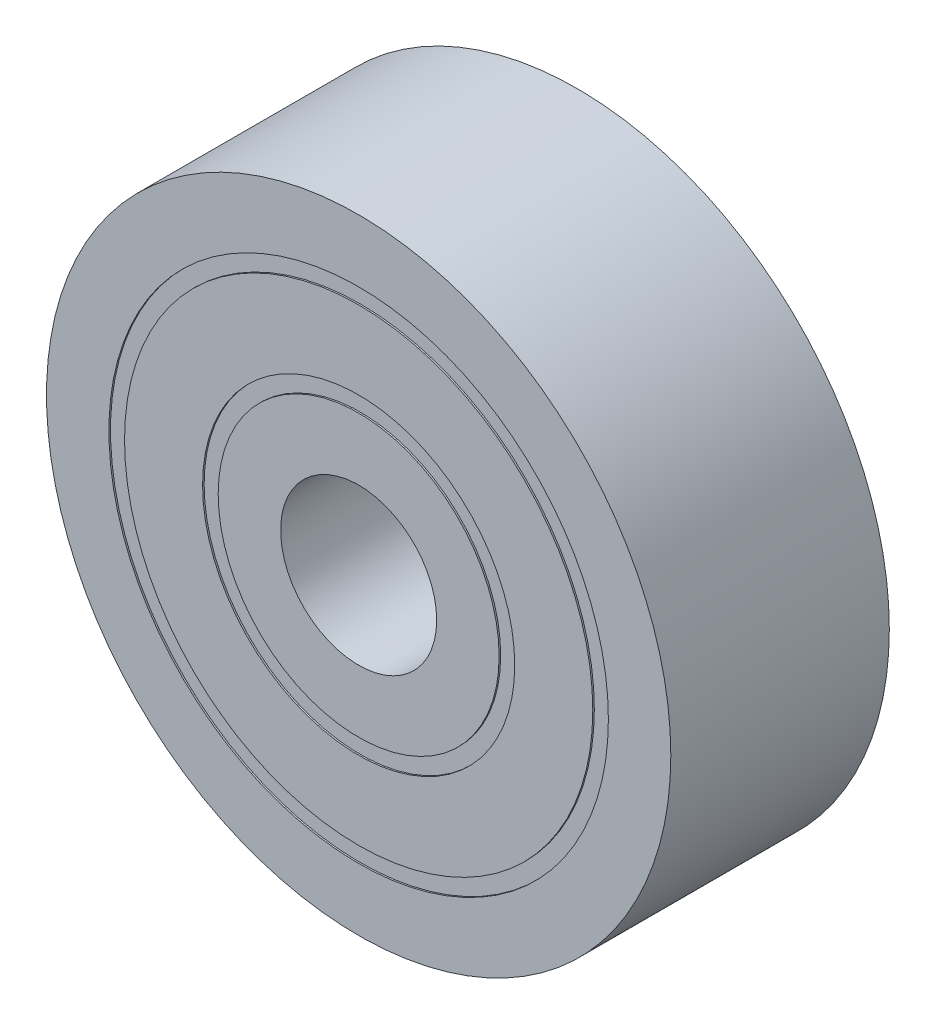
ISO-10303-21;
HEADER;
FILE_DESCRIPTION(('STEP AP214'),'2;1');
FILE_NAME('part.step','',(''),(''),'','','');
FILE_SCHEMA(('AUTOMOTIVE_DESIGN { 1 0 10303 214 1 1 1 1 }'));
ENDSEC;
DATA;
#1=APPLICATION_CONTEXT('core data for automotive mechanical design processes');
#2=APPLICATION_PROTOCOL_DEFINITION('international standard','automotive_design',2000,#1);
#3=PRODUCT_CONTEXT('',#1,'mechanical');
#4=PRODUCT('Part','Part','',(#3));
#5=PRODUCT_RELATED_PRODUCT_CATEGORY('part','',(#4));
#6=PRODUCT_DEFINITION_FORMATION('','',#4);
#7=PRODUCT_DEFINITION_CONTEXT('part definition',#1,'design');
#8=PRODUCT_DEFINITION('design','',#6,#7);
#9=PRODUCT_DEFINITION_SHAPE('','',#8);
#10=(LENGTH_UNIT() NAMED_UNIT(*) SI_UNIT(.MILLI.,.METRE.));
#11=(NAMED_UNIT(*) PLANE_ANGLE_UNIT() SI_UNIT($,.RADIAN.));
#12=(NAMED_UNIT(*) SI_UNIT($,.STERADIAN.) SOLID_ANGLE_UNIT());
#13=UNCERTAINTY_MEASURE_WITH_UNIT(LENGTH_MEASURE(1.E-05),#10,'distance_accuracy_value','');
#14=(GEOMETRIC_REPRESENTATION_CONTEXT(3) GLOBAL_UNCERTAINTY_ASSIGNED_CONTEXT((#13)) GLOBAL_UNIT_ASSIGNED_CONTEXT((#10,
#11,#12)) REPRESENTATION_CONTEXT('',''));
#15=CARTESIAN_POINT('',(0.,0.,0.));
#16=DIRECTION('',(0.,0.,1.));
#17=DIRECTION('',(1.,0.,0.));
#18=AXIS2_PLACEMENT_3D('',#15,#16,#17);
#19=CARTESIAN_POINT('',(0.,0.,-17.5));
#20=DIRECTION('',(0.,0.,1.));
#21=DIRECTION('',(1.,0.,0.));
#22=AXIS2_PLACEMENT_3D('',#19,#20,#21);
#23=PLANE('',#22);
#24=CARTESIAN_POINT('',(0.,0.,-17.5));
#25=DIRECTION('',(0.,0.,1.));
#26=DIRECTION('',(1.,0.,0.));
#27=AXIS2_PLACEMENT_3D('',#24,#25,#26);
#28=CIRCLE('',#27,12.5);
#29=CARTESIAN_POINT('',(12.5,0.,-17.5));
#30=VERTEX_POINT('',#29);
#31=EDGE_CURVE('E78',#30,#30,#28,.T.);
#32=ORIENTED_EDGE('',*,*,#31,.T.);
#33=EDGE_LOOP('',(#32));
#34=FACE_BOUND('',#33,.T.);
#35=CARTESIAN_POINT('',(0.,0.,-17.5));
#36=DIRECTION('',(0.,0.,1.));
#37=DIRECTION('',(1.,0.,0.));
#38=AXIS2_PLACEMENT_3D('',#35,#36,#37);
#39=CIRCLE('',#38,22.5);
#40=CARTESIAN_POINT('',(22.5,0.,-17.5));
#41=VERTEX_POINT('',#40);
#42=EDGE_CURVE('E123',#41,#41,#39,.T.);
#43=ORIENTED_EDGE('',*,*,#42,.F.);
#44=EDGE_LOOP('',(#43));
#45=FACE_BOUND('',#44,.T.);
#46=ADVANCED_FACE('F63',(#34,#45),#23,.F.);
#47=CARTESIAN_POINT('',(0.,0.,17.5));
#48=DIRECTION('',(0.,0.,1.));
#49=DIRECTION('',(1.,0.,0.));
#50=AXIS2_PLACEMENT_3D('',#47,#48,#49);
#51=PLANE('',#50);
#52=CARTESIAN_POINT('',(0.,0.,17.5));
#53=DIRECTION('',(0.,0.,1.));
#54=DIRECTION('',(1.,0.,0.));
#55=AXIS2_PLACEMENT_3D('',#52,#53,#54);
#56=CIRCLE('',#55,12.5);
#57=CARTESIAN_POINT('',(12.5,0.,17.5));
#58=VERTEX_POINT('',#57);
#59=EDGE_CURVE('E76',#58,#58,#56,.T.);
#60=ORIENTED_EDGE('',*,*,#59,.F.);
#61=EDGE_LOOP('',(#60));
#62=FACE_BOUND('',#61,.T.);
#63=CARTESIAN_POINT('',(0.,0.,17.5));
#64=DIRECTION('',(0.,0.,1.));
#65=DIRECTION('',(1.,0.,0.));
#66=AXIS2_PLACEMENT_3D('',#63,#64,#65);
#67=CIRCLE('',#66,22.5);
#68=CARTESIAN_POINT('',(22.5,0.,17.5));
#69=VERTEX_POINT('',#68);
#70=EDGE_CURVE('E91',#69,#69,#67,.T.);
#71=ORIENTED_EDGE('',*,*,#70,.T.);
#72=EDGE_LOOP('',(#71));
#73=FACE_BOUND('',#72,.T.);
#74=ADVANCED_FACE('F171',(#62,#73),#51,.T.);
#75=CARTESIAN_POINT('',(0.,0.,17.5));
#76=DIRECTION('',(0.,0.,1.));
#77=DIRECTION('',(1.,0.,0.));
#78=AXIS2_PLACEMENT_3D('',#75,#76,#77);
#79=CIRCLE('',#78,40.);
#80=CARTESIAN_POINT('',(40.,0.,17.5));
#81=VERTEX_POINT('',#80);
#82=EDGE_CURVE('E102',#81,#81,#79,.T.);
#83=ORIENTED_EDGE('',*,*,#82,.F.);
#84=EDGE_LOOP('',(#83));
#85=FACE_BOUND('',#84,.T.);
#86=CARTESIAN_POINT('',(0.,0.,17.5));
#87=DIRECTION('',(0.,0.,1.));
#88=DIRECTION('',(1.,0.,0.));
#89=AXIS2_PLACEMENT_3D('',#86,#87,#88);
#90=CIRCLE('',#89,50.);
#91=CARTESIAN_POINT('',(50.,0.,17.5));
#92=VERTEX_POINT('',#91);
#93=EDGE_CURVE('E13',#92,#92,#90,.T.);
#94=ORIENTED_EDGE('',*,*,#93,.T.);
#95=EDGE_LOOP('',(#94));
#96=FACE_BOUND('',#95,.T.);
#97=ADVANCED_FACE('F174',(#85,#96),#51,.T.);
#98=CARTESIAN_POINT('',(0.,0.,-17.5));
#99=DIRECTION('',(0.,0.,1.));
#100=DIRECTION('',(1.,0.,0.));
#101=AXIS2_PLACEMENT_3D('',#98,#99,#100);
#102=CIRCLE('',#101,40.);
#103=CARTESIAN_POINT('',(40.,0.,-17.5));
#104=VERTEX_POINT('',#103);
#105=EDGE_CURVE('E134',#104,#104,#102,.T.);
#106=ORIENTED_EDGE('',*,*,#105,.T.);
#107=EDGE_LOOP('',(#106));
#108=FACE_BOUND('',#107,.T.);
#109=CARTESIAN_POINT('',(0.,0.,-17.5));
#110=DIRECTION('',(0.,0.,1.));
#111=DIRECTION('',(1.,0.,0.));
#112=AXIS2_PLACEMENT_3D('',#109,#110,#111);
#113=CIRCLE('',#112,50.);
#114=CARTESIAN_POINT('',(50.,0.,-17.5));
#115=VERTEX_POINT('',#114);
#116=EDGE_CURVE('E67',#115,#115,#113,.T.);
#117=ORIENTED_EDGE('',*,*,#116,.F.);
#118=EDGE_LOOP('',(#117));
#119=FACE_BOUND('',#118,.T.);
#120=ADVANCED_FACE('F164',(#108,#119),#23,.F.);
#121=CARTESIAN_POINT('',(0.,0.,17.5));
#122=DIRECTION('',(0.,0.,-1.));
#123=DIRECTION('',(-1.,0.,0.));
#124=AXIS2_PLACEMENT_3D('',#121,#122,#123);
#125=CYLINDRICAL_SURFACE('',#124,50.);
#126=ORIENTED_EDGE('',*,*,#93,.F.);
#127=EDGE_LOOP('',(#126));
#128=FACE_BOUND('',#127,.T.);
#129=ORIENTED_EDGE('',*,*,#116,.T.);
#130=EDGE_LOOP('',(#129));
#131=FACE_BOUND('',#130,.T.);
#132=ADVANCED_FACE('F65',(#128,#131),#125,.T.);
#133=CARTESIAN_POINT('',(0.,0.,17.5));
#134=DIRECTION('',(0.,0.,-1.));
#135=DIRECTION('',(-1.,0.,0.));
#136=AXIS2_PLACEMENT_3D('',#133,#134,#135);
#137=CYLINDRICAL_SURFACE('',#136,12.5);
#138=ORIENTED_EDGE('',*,*,#59,.T.);
#139=EDGE_LOOP('',(#138));
#140=FACE_BOUND('',#139,.T.);
#141=ORIENTED_EDGE('',*,*,#31,.F.);
#142=EDGE_LOOP('',(#141));
#143=FACE_BOUND('',#142,.T.);
#144=ADVANCED_FACE('F180',(#140,#143),#137,.F.);
#145=CARTESIAN_POINT('',(0.,0.,17.25));
#146=DIRECTION('',(0.,0.,1.));
#147=DIRECTION('',(1.,0.,0.));
#148=AXIS2_PLACEMENT_3D('',#145,#146,#147);
#149=CYLINDRICAL_SURFACE('',#148,22.5);
#150=CARTESIAN_POINT('',(0.,0.,17.25));
#151=DIRECTION('',(0.,0.,1.));
#152=DIRECTION('',(1.,0.,0.));
#153=AXIS2_PLACEMENT_3D('',#150,#151,#152);
#154=CIRCLE('',#153,22.5);
#155=CARTESIAN_POINT('',(22.5,0.,17.25));
#156=VERTEX_POINT('',#155);
#157=EDGE_CURVE('E90',#156,#156,#154,.T.);
#158=ORIENTED_EDGE('',*,*,#157,.T.);
#159=EDGE_LOOP('',(#158));
#160=FACE_BOUND('',#159,.T.);
#161=ORIENTED_EDGE('',*,*,#70,.F.);
#162=EDGE_LOOP('',(#161));
#163=FACE_BOUND('',#162,.T.);
#164=ADVANCED_FACE('F225',(#160,#163),#149,.T.);
#165=CARTESIAN_POINT('',(0.,0.,17.25));
#166=DIRECTION('',(0.,0.,1.));
#167=DIRECTION('',(1.,0.,0.));
#168=AXIS2_PLACEMENT_3D('',#165,#166,#167);
#169=CYLINDRICAL_SURFACE('',#168,25.);
#170=CARTESIAN_POINT('',(0.,0.,17.25));
#171=DIRECTION('',(0.,0.,1.));
#172=DIRECTION('',(1.,0.,0.));
#173=AXIS2_PLACEMENT_3D('',#170,#171,#172);
#174=CIRCLE('',#173,25.);
#175=CARTESIAN_POINT('',(25.,0.,17.25));
#176=VERTEX_POINT('',#175);
#177=EDGE_CURVE('E82',#176,#176,#174,.T.);
#178=ORIENTED_EDGE('',*,*,#177,.F.);
#179=EDGE_LOOP('',(#178));
#180=FACE_BOUND('',#179,.T.);
#181=CARTESIAN_POINT('',(0.,0.,17.5));
#182=DIRECTION('',(0.,0.,1.));
#183=DIRECTION('',(1.,0.,0.));
#184=AXIS2_PLACEMENT_3D('',#181,#182,#183);
#185=CIRCLE('',#184,25.);
#186=CARTESIAN_POINT('',(25.,0.,17.5));
#187=VERTEX_POINT('',#186);
#188=EDGE_CURVE('E86',#187,#187,#185,.T.);
#189=ORIENTED_EDGE('',*,*,#188,.T.);
#190=EDGE_LOOP('',(#189));
#191=FACE_BOUND('',#190,.T.);
#192=ADVANCED_FACE('F221',(#180,#191),#169,.F.);
#193=CARTESIAN_POINT('',(0.,0.,17.25));
#194=DIRECTION('',(0.,0.,1.));
#195=DIRECTION('',(1.,0.,0.));
#196=AXIS2_PLACEMENT_3D('',#193,#194,#195);
#197=PLANE('',#196);
#198=ORIENTED_EDGE('',*,*,#157,.F.);
#199=EDGE_LOOP('',(#198));
#200=FACE_BOUND('',#199,.T.);
#201=ORIENTED_EDGE('',*,*,#177,.T.);
#202=EDGE_LOOP('',(#201));
#203=FACE_BOUND('',#202,.T.);
#204=ADVANCED_FACE('F217',(#200,#203),#197,.T.);
#205=CARTESIAN_POINT('',(0.,0.,17.25));
#206=DIRECTION('',(0.,0.,1.));
#207=DIRECTION('',(1.,0.,0.));
#208=AXIS2_PLACEMENT_3D('',#205,#206,#207);
#209=CYLINDRICAL_SURFACE('',#208,37.5);
#210=CARTESIAN_POINT('',(0.,0.,17.25));
#211=DIRECTION('',(0.,0.,1.));
#212=DIRECTION('',(1.,0.,0.));
#213=AXIS2_PLACEMENT_3D('',#210,#211,#212);
#214=CIRCLE('',#213,37.5);
#215=CARTESIAN_POINT('',(37.5,0.,17.25));
#216=VERTEX_POINT('',#215);
#217=EDGE_CURVE('E106',#216,#216,#214,.T.);
#218=ORIENTED_EDGE('',*,*,#217,.T.);
#219=EDGE_LOOP('',(#218));
#220=FACE_BOUND('',#219,.T.);
#221=CARTESIAN_POINT('',(0.,0.,17.5));
#222=DIRECTION('',(0.,0.,1.));
#223=DIRECTION('',(1.,0.,0.));
#224=AXIS2_PLACEMENT_3D('',#221,#222,#223);
#225=CIRCLE('',#224,37.5);
#226=CARTESIAN_POINT('',(37.5,0.,17.5));
#227=VERTEX_POINT('',#226);
#228=EDGE_CURVE('E107',#227,#227,#225,.T.);
#229=ORIENTED_EDGE('',*,*,#228,.F.);
#230=EDGE_LOOP('',(#229));
#231=FACE_BOUND('',#230,.T.);
#232=ADVANCED_FACE('F213',(#220,#231),#209,.T.);
#233=CARTESIAN_POINT('',(0.,0.,17.25));
#234=DIRECTION('',(0.,0.,1.));
#235=DIRECTION('',(1.,0.,0.));
#236=AXIS2_PLACEMENT_3D('',#233,#234,#235);
#237=CYLINDRICAL_SURFACE('',#236,40.);
#238=CARTESIAN_POINT('',(0.,0.,17.25));
#239=DIRECTION('',(0.,0.,1.));
#240=DIRECTION('',(1.,0.,0.));
#241=AXIS2_PLACEMENT_3D('',#238,#239,#240);
#242=CIRCLE('',#241,40.);
#243=CARTESIAN_POINT('',(40.,0.,17.25));
#244=VERTEX_POINT('',#243);
#245=EDGE_CURVE('E95',#244,#244,#242,.T.);
#246=ORIENTED_EDGE('',*,*,#245,.F.);
#247=EDGE_LOOP('',(#246));
#248=FACE_BOUND('',#247,.T.);
#249=ORIENTED_EDGE('',*,*,#82,.T.);
#250=EDGE_LOOP('',(#249));
#251=FACE_BOUND('',#250,.T.);
#252=ADVANCED_FACE('F209',(#248,#251),#237,.F.);
#253=CARTESIAN_POINT('',(0.,0.,17.25));
#254=DIRECTION('',(0.,0.,1.));
#255=DIRECTION('',(1.,0.,0.));
#256=AXIS2_PLACEMENT_3D('',#253,#254,#255);
#257=PLANE('',#256);
#258=ORIENTED_EDGE('',*,*,#217,.F.);
#259=EDGE_LOOP('',(#258));
#260=FACE_BOUND('',#259,.T.);
#261=ORIENTED_EDGE('',*,*,#245,.T.);
#262=EDGE_LOOP('',(#261));
#263=FACE_BOUND('',#262,.T.);
#264=ADVANCED_FACE('F206',(#260,#263),#257,.T.);
#265=ORIENTED_EDGE('',*,*,#188,.F.);
#266=EDGE_LOOP('',(#265));
#267=FACE_BOUND('',#266,.T.);
#268=ORIENTED_EDGE('',*,*,#228,.T.);
#269=EDGE_LOOP('',(#268));
#270=FACE_BOUND('',#269,.T.);
#271=ADVANCED_FACE('F183',(#267,#270),#51,.T.);
#272=CARTESIAN_POINT('',(0.,0.,-17.25));
#273=DIRECTION('',(0.,0.,-1.));
#274=DIRECTION('',(-1.,0.,0.));
#275=AXIS2_PLACEMENT_3D('',#272,#273,#274);
#276=CYLINDRICAL_SURFACE('',#275,22.5);
#277=CARTESIAN_POINT('',(0.,0.,-17.25));
#278=DIRECTION('',(0.,0.,1.));
#279=DIRECTION('',(1.,0.,0.));
#280=AXIS2_PLACEMENT_3D('',#277,#278,#279);
#281=CIRCLE('',#280,22.5);
#282=CARTESIAN_POINT('',(22.5,0.,-17.25));
#283=VERTEX_POINT('',#282);
#284=EDGE_CURVE('E122',#283,#283,#281,.T.);
#285=ORIENTED_EDGE('',*,*,#284,.F.);
#286=EDGE_LOOP('',(#285));
#287=FACE_BOUND('',#286,.T.);
#288=ORIENTED_EDGE('',*,*,#42,.T.);
#289=EDGE_LOOP('',(#288));
#290=FACE_BOUND('',#289,.T.);
#291=ADVANCED_FACE('F201',(#287,#290),#276,.T.);
#292=CARTESIAN_POINT('',(0.,0.,-17.25));
#293=DIRECTION('',(0.,0.,-1.));
#294=DIRECTION('',(-1.,0.,0.));
#295=AXIS2_PLACEMENT_3D('',#292,#293,#294);
#296=CYLINDRICAL_SURFACE('',#295,25.);
#297=CARTESIAN_POINT('',(0.,0.,-17.25));
#298=DIRECTION('',(0.,0.,1.));
#299=DIRECTION('',(1.,0.,0.));
#300=AXIS2_PLACEMENT_3D('',#297,#298,#299);
#301=CIRCLE('',#300,25.);
#302=CARTESIAN_POINT('',(25.,0.,-17.25));
#303=VERTEX_POINT('',#302);
#304=EDGE_CURVE('E111',#303,#303,#301,.T.);
#305=ORIENTED_EDGE('',*,*,#304,.T.);
#306=EDGE_LOOP('',(#305));
#307=FACE_BOUND('',#306,.T.);
#308=CARTESIAN_POINT('',(0.,0.,-17.5));
#309=DIRECTION('',(0.,0.,1.));
#310=DIRECTION('',(1.,0.,0.));
#311=AXIS2_PLACEMENT_3D('',#308,#309,#310);
#312=CIRCLE('',#311,25.);
#313=CARTESIAN_POINT('',(25.,0.,-17.5));
#314=VERTEX_POINT('',#313);
#315=EDGE_CURVE('E118',#314,#314,#312,.T.);
#316=ORIENTED_EDGE('',*,*,#315,.F.);
#317=EDGE_LOOP('',(#316));
#318=FACE_BOUND('',#317,.T.);
#319=ADVANCED_FACE('F197',(#307,#318),#296,.F.);
#320=CARTESIAN_POINT('',(0.,0.,-17.25));
#321=DIRECTION('',(0.,0.,-1.));
#322=DIRECTION('',(1.,0.,0.));
#323=AXIS2_PLACEMENT_3D('',#320,#321,#322);
#324=PLANE('',#323);
#325=ORIENTED_EDGE('',*,*,#284,.T.);
#326=EDGE_LOOP('',(#325));
#327=FACE_BOUND('',#326,.T.);
#328=ORIENTED_EDGE('',*,*,#304,.F.);
#329=EDGE_LOOP('',(#328));
#330=FACE_BOUND('',#329,.T.);
#331=ADVANCED_FACE('F157',(#327,#330),#324,.T.);
#332=CARTESIAN_POINT('',(0.,0.,-17.25));
#333=DIRECTION('',(0.,0.,-1.));
#334=DIRECTION('',(-1.,0.,0.));
#335=AXIS2_PLACEMENT_3D('',#332,#333,#334);
#336=CYLINDRICAL_SURFACE('',#335,37.5);
#337=CARTESIAN_POINT('',(0.,0.,-17.25));
#338=DIRECTION('',(0.,0.,1.));
#339=DIRECTION('',(1.,0.,0.));
#340=AXIS2_PLACEMENT_3D('',#337,#338,#339);
#341=CIRCLE('',#340,37.5);
#342=CARTESIAN_POINT('',(37.5,0.,-17.25));
#343=VERTEX_POINT('',#342);
#344=EDGE_CURVE('E138',#343,#343,#341,.T.);
#345=ORIENTED_EDGE('',*,*,#344,.F.);
#346=EDGE_LOOP('',(#345));
#347=FACE_BOUND('',#346,.T.);
#348=CARTESIAN_POINT('',(0.,0.,-17.5));
#349=DIRECTION('',(0.,0.,1.));
#350=DIRECTION('',(1.,0.,0.));
#351=AXIS2_PLACEMENT_3D('',#348,#349,#350);
#352=CIRCLE('',#351,37.5);
#353=CARTESIAN_POINT('',(37.5,0.,-17.5));
#354=VERTEX_POINT('',#353);
#355=EDGE_CURVE('E139',#354,#354,#352,.T.);
#356=ORIENTED_EDGE('',*,*,#355,.T.);
#357=EDGE_LOOP('',(#356));
#358=FACE_BOUND('',#357,.T.);
#359=ADVANCED_FACE('F153',(#347,#358),#336,.T.);
#360=CARTESIAN_POINT('',(0.,0.,-17.25));
#361=DIRECTION('',(0.,0.,-1.));
#362=DIRECTION('',(-1.,0.,0.));
#363=AXIS2_PLACEMENT_3D('',#360,#361,#362);
#364=CYLINDRICAL_SURFACE('',#363,40.);
#365=CARTESIAN_POINT('',(0.,0.,-17.25));
#366=DIRECTION('',(0.,0.,1.));
#367=DIRECTION('',(1.,0.,0.));
#368=AXIS2_PLACEMENT_3D('',#365,#366,#367);
#369=CIRCLE('',#368,40.);
#370=CARTESIAN_POINT('',(40.,0.,-17.25));
#371=VERTEX_POINT('',#370);
#372=EDGE_CURVE('E127',#371,#371,#369,.T.);
#373=ORIENTED_EDGE('',*,*,#372,.T.);
#374=EDGE_LOOP('',(#373));
#375=FACE_BOUND('',#374,.T.);
#376=ORIENTED_EDGE('',*,*,#105,.F.);
#377=EDGE_LOOP('',(#376));
#378=FACE_BOUND('',#377,.T.);
#379=ADVANCED_FACE('F156',(#375,#378),#364,.F.);
#380=CARTESIAN_POINT('',(0.,0.,-17.25));
#381=DIRECTION('',(0.,0.,-1.));
#382=DIRECTION('',(1.,0.,0.));
#383=AXIS2_PLACEMENT_3D('',#380,#381,#382);
#384=PLANE('',#383);
#385=ORIENTED_EDGE('',*,*,#344,.T.);
#386=EDGE_LOOP('',(#385));
#387=FACE_BOUND('',#386,.T.);
#388=ORIENTED_EDGE('',*,*,#372,.F.);
#389=EDGE_LOOP('',(#388));
#390=FACE_BOUND('',#389,.T.);
#391=ADVANCED_FACE('F150',(#387,#390),#384,.T.);
#392=ORIENTED_EDGE('',*,*,#315,.T.);
#393=EDGE_LOOP('',(#392));
#394=FACE_BOUND('',#393,.T.);
#395=ORIENTED_EDGE('',*,*,#355,.F.);
#396=EDGE_LOOP('',(#395));
#397=FACE_BOUND('',#396,.T.);
#398=ADVANCED_FACE('F161',(#394,#397),#23,.F.);
#399=CLOSED_SHELL('',(#46,#74,#97,#120,#132,#144,#164,#192,#204,#232,#252,#264,#271,#291,#319,
#331,#359,#379,#391,#398));
#400=MANIFOLD_SOLID_BREP('B2',#399);
#401=ADVANCED_BREP_SHAPE_REPRESENTATION('',(#18,#400),#14);
#402=SHAPE_DEFINITION_REPRESENTATION(#9,#401);
ENDSEC;
END-ISO-10303-21;
